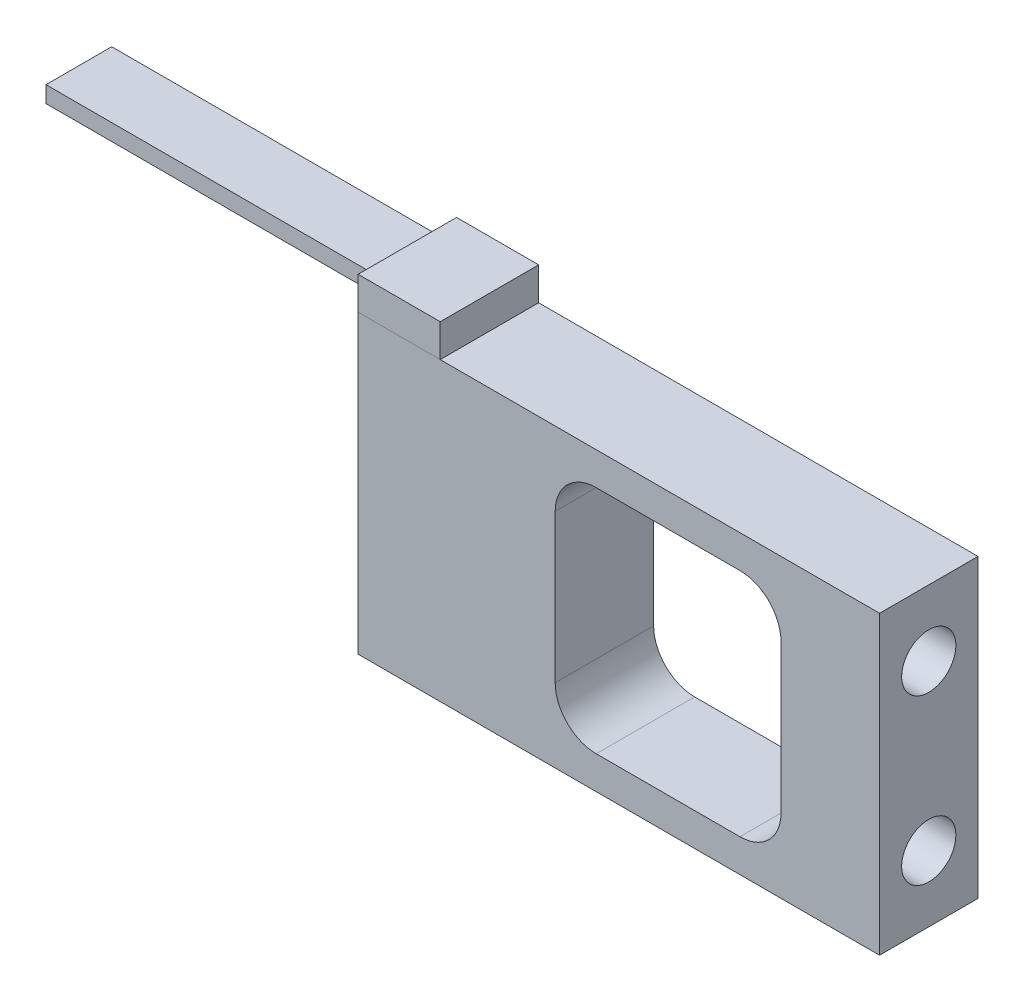
ISO-10303-21;
HEADER;
FILE_DESCRIPTION(('STEP AP214'),'2;1');
FILE_NAME('part.step','',(''),(''),'','','');
FILE_SCHEMA(('AUTOMOTIVE_DESIGN { 1 0 10303 214 1 1 1 1 }'));
ENDSEC;
DATA;
#1=APPLICATION_CONTEXT('core data for automotive mechanical design processes');
#2=APPLICATION_PROTOCOL_DEFINITION('international standard','automotive_design',2000,#1);
#3=PRODUCT_CONTEXT('',#1,'mechanical');
#4=PRODUCT('Part','Part','',(#3));
#5=PRODUCT_RELATED_PRODUCT_CATEGORY('part','',(#4));
#6=PRODUCT_DEFINITION_FORMATION('','',#4);
#7=PRODUCT_DEFINITION_CONTEXT('part definition',#1,'design');
#8=PRODUCT_DEFINITION('design','',#6,#7);
#9=PRODUCT_DEFINITION_SHAPE('','',#8);
#10=(LENGTH_UNIT() NAMED_UNIT(*) SI_UNIT(.MILLI.,.METRE.));
#11=(NAMED_UNIT(*) PLANE_ANGLE_UNIT() SI_UNIT($,.RADIAN.));
#12=(NAMED_UNIT(*) SI_UNIT($,.STERADIAN.) SOLID_ANGLE_UNIT());
#13=UNCERTAINTY_MEASURE_WITH_UNIT(LENGTH_MEASURE(1.E-05),#10,'distance_accuracy_value','');
#14=(GEOMETRIC_REPRESENTATION_CONTEXT(3) GLOBAL_UNCERTAINTY_ASSIGNED_CONTEXT((#13)) GLOBAL_UNIT_ASSIGNED_CONTEXT((#10,
#11,#12)) REPRESENTATION_CONTEXT('',''));
#15=CARTESIAN_POINT('',(0.,0.,0.));
#16=DIRECTION('',(0.,0.,1.));
#17=DIRECTION('',(1.,0.,0.));
#18=AXIS2_PLACEMENT_3D('',#15,#16,#17);
#19=CARTESIAN_POINT('',(-15.875,11.017,2.9972));
#20=DIRECTION('',(1.,0.,0.));
#21=DIRECTION('',(0.,1.,0.));
#22=AXIS2_PLACEMENT_3D('',#19,#20,#21);
#23=PLANE('',#22);
#24=DIRECTION('',(0.,0.,1.));
#25=VECTOR('',#24,1.);
#26=CARTESIAN_POINT('',(-15.875,9.01699999999999,2.9972));
#27=LINE('',#26,#25);
#28=CARTESIAN_POINT('',(-15.875,9.01699999999999,-2.9972));
#29=VERTEX_POINT('',#28);
#30=CARTESIAN_POINT('',(-15.875,9.01699999999999,2.9972));
#31=VERTEX_POINT('',#30);
#32=EDGE_CURVE('E132',#29,#31,#27,.T.);
#33=ORIENTED_EDGE('',*,*,#32,.T.);
#34=DIRECTION('',(0.,-1.,0.));
#35=VECTOR('',#34,1.);
#36=CARTESIAN_POINT('',(-15.875,11.017,2.9972));
#37=LINE('',#36,#35);
#38=CARTESIAN_POINT('',(-15.875,11.017,2.9972));
#39=VERTEX_POINT('',#38);
#40=EDGE_CURVE('E12',#39,#31,#37,.T.);
#41=ORIENTED_EDGE('',*,*,#40,.F.);
#42=DIRECTION('',(0.,0.,1.));
#43=VECTOR('',#42,1.);
#44=CARTESIAN_POINT('',(-15.875,11.017,2.9972));
#45=LINE('',#44,#43);
#46=CARTESIAN_POINT('',(-15.875,11.017,-2.9972));
#47=VERTEX_POINT('',#46);
#48=EDGE_CURVE('E141',#47,#39,#45,.T.);
#49=ORIENTED_EDGE('',*,*,#48,.F.);
#50=DIRECTION('',(0.,-1.,0.));
#51=VECTOR('',#50,1.);
#52=CARTESIAN_POINT('',(-15.875,11.017,-2.9972));
#53=LINE('',#52,#51);
#54=EDGE_CURVE('E150',#47,#29,#53,.T.);
#55=ORIENTED_EDGE('',*,*,#54,.T.);
#56=EDGE_LOOP('',(#33,#41,#49,#55));
#57=FACE_BOUND('',#56,.T.);
#58=DIRECTION('',(0.,-1.,0.));
#59=VECTOR('',#58,1.);
#60=CARTESIAN_POINT('',(-15.875,10.517,-2.));
#61=LINE('',#60,#59);
#62=CARTESIAN_POINT('',(-15.875,10.517,-2.));
#63=VERTEX_POINT('',#62);
#64=CARTESIAN_POINT('',(-15.875,9.51699999999999,-2.));
#65=VERTEX_POINT('',#64);
#66=EDGE_CURVE('E131',#63,#65,#61,.T.);
#67=ORIENTED_EDGE('',*,*,#66,.F.);
#68=DIRECTION('',(0.,0.,-1.));
#69=VECTOR('',#68,1.);
#70=CARTESIAN_POINT('',(-15.875,10.517,2.));
#71=LINE('',#70,#69);
#72=CARTESIAN_POINT('',(-15.875,10.517,2.));
#73=VERTEX_POINT('',#72);
#74=EDGE_CURVE('E128',#73,#63,#71,.T.);
#75=ORIENTED_EDGE('',*,*,#74,.F.);
#76=DIRECTION('',(0.,1.,0.));
#77=VECTOR('',#76,1.);
#78=CARTESIAN_POINT('',(-15.875,10.517,2.));
#79=LINE('',#78,#77);
#80=CARTESIAN_POINT('',(-15.875,9.51699999999999,2.));
#81=VERTEX_POINT('',#80);
#82=EDGE_CURVE('E66',#81,#73,#79,.T.);
#83=ORIENTED_EDGE('',*,*,#82,.F.);
#84=DIRECTION('',(0.,0.,1.));
#85=VECTOR('',#84,1.);
#86=CARTESIAN_POINT('',(-15.875,9.51699999999999,2.));
#87=LINE('',#86,#85);
#88=EDGE_CURVE('E61',#65,#81,#87,.T.);
#89=ORIENTED_EDGE('',*,*,#88,.F.);
#90=EDGE_LOOP('',(#67,#75,#83,#89));
#91=FACE_BOUND('',#90,.T.);
#92=ADVANCED_FACE('F47',(#57,#91),#23,.F.);
#93=CARTESIAN_POINT('',(-15.875,11.017,2.9972));
#94=DIRECTION('',(0.,0.,-1.));
#95=DIRECTION('',(-1.,0.,0.));
#96=AXIS2_PLACEMENT_3D('',#93,#94,#95);
#97=PLANE('',#96);
#98=DIRECTION('',(1.,0.,0.));
#99=VECTOR('',#98,1.);
#100=CARTESIAN_POINT('',(-15.875,9.01699999999999,2.9972));
#101=LINE('',#100,#99);
#102=CARTESIAN_POINT('',(-10.875,9.017,2.9972));
#103=VERTEX_POINT('',#102);
#104=EDGE_CURVE('E135',#31,#103,#101,.T.);
#105=ORIENTED_EDGE('',*,*,#104,.T.);
#106=DIRECTION('',(0.,-1.,0.));
#107=VECTOR('',#106,1.);
#108=CARTESIAN_POINT('',(-10.875,11.017,2.9972));
#109=LINE('',#108,#107);
#110=CARTESIAN_POINT('',(-10.875,11.017,2.9972));
#111=VERTEX_POINT('',#110);
#112=EDGE_CURVE('E54',#111,#103,#109,.T.);
#113=ORIENTED_EDGE('',*,*,#112,.F.);
#114=DIRECTION('',(1.,0.,0.));
#115=VECTOR('',#114,1.);
#116=CARTESIAN_POINT('',(-15.875,11.017,2.9972));
#117=LINE('',#116,#115);
#118=EDGE_CURVE('E144',#39,#111,#117,.T.);
#119=ORIENTED_EDGE('',*,*,#118,.F.);
#120=ORIENTED_EDGE('',*,*,#40,.T.);
#121=EDGE_LOOP('',(#105,#113,#119,#120));
#122=FACE_BOUND('',#121,.T.);
#123=ADVANCED_FACE('F181',(#122),#97,.F.);
#124=CARTESIAN_POINT('',(-10.875,11.017,2.9972));
#125=DIRECTION('',(-1.,0.,0.));
#126=DIRECTION('',(0.,-1.,0.));
#127=AXIS2_PLACEMENT_3D('',#124,#125,#126);
#128=PLANE('',#127);
#129=DIRECTION('',(0.,0.,-1.));
#130=VECTOR('',#129,1.);
#131=CARTESIAN_POINT('',(-10.875,9.017,2.9972));
#132=LINE('',#131,#130);
#133=CARTESIAN_POINT('',(-10.875,9.017,-2.9972));
#134=VERTEX_POINT('',#133);
#135=EDGE_CURVE('E153',#103,#134,#132,.T.);
#136=ORIENTED_EDGE('',*,*,#135,.T.);
#137=DIRECTION('',(0.,-1.,0.));
#138=VECTOR('',#137,1.);
#139=CARTESIAN_POINT('',(-10.875,11.017,-2.9972));
#140=LINE('',#139,#138);
#141=CARTESIAN_POINT('',(-10.875,11.017,-2.9972));
#142=VERTEX_POINT('',#141);
#143=EDGE_CURVE('E158',#142,#134,#140,.T.);
#144=ORIENTED_EDGE('',*,*,#143,.F.);
#145=DIRECTION('',(0.,0.,-1.));
#146=VECTOR('',#145,1.);
#147=CARTESIAN_POINT('',(-10.875,11.017,2.9972));
#148=LINE('',#147,#146);
#149=EDGE_CURVE('E147',#111,#142,#148,.T.);
#150=ORIENTED_EDGE('',*,*,#149,.F.);
#151=ORIENTED_EDGE('',*,*,#112,.T.);
#152=EDGE_LOOP('',(#136,#144,#150,#151));
#153=FACE_BOUND('',#152,.T.);
#154=ADVANCED_FACE('F165',(#153),#128,.F.);
#155=CARTESIAN_POINT('',(-15.875,11.017,-2.9972));
#156=DIRECTION('',(0.,0.,1.));
#157=DIRECTION('',(1.,0.,0.));
#158=AXIS2_PLACEMENT_3D('',#155,#156,#157);
#159=PLANE('',#158);
#160=DIRECTION('',(-1.,0.,0.));
#161=VECTOR('',#160,1.);
#162=CARTESIAN_POINT('',(-15.875,9.01699999999999,-2.9972));
#163=LINE('',#162,#161);
#164=EDGE_CURVE('E145',#134,#29,#163,.T.);
#165=ORIENTED_EDGE('',*,*,#164,.T.);
#166=ORIENTED_EDGE('',*,*,#54,.F.);
#167=DIRECTION('',(-1.,0.,0.));
#168=VECTOR('',#167,1.);
#169=CARTESIAN_POINT('',(-15.875,11.017,-2.9972));
#170=LINE('',#169,#168);
#171=EDGE_CURVE('E149',#142,#47,#170,.T.);
#172=ORIENTED_EDGE('',*,*,#171,.F.);
#173=ORIENTED_EDGE('',*,*,#143,.T.);
#174=EDGE_LOOP('',(#165,#166,#172,#173));
#175=FACE_BOUND('',#174,.T.);
#176=ADVANCED_FACE('F174',(#175),#159,.F.);
#177=CARTESIAN_POINT('',(0.,11.017,0.));
#178=DIRECTION('',(0.,-1.,0.));
#179=DIRECTION('',(1.,0.,0.));
#180=AXIS2_PLACEMENT_3D('',#177,#178,#179);
#181=PLANE('',#180);
#182=ORIENTED_EDGE('',*,*,#48,.T.);
#183=ORIENTED_EDGE('',*,*,#118,.T.);
#184=ORIENTED_EDGE('',*,*,#149,.T.);
#185=ORIENTED_EDGE('',*,*,#171,.T.);
#186=EDGE_LOOP('',(#182,#183,#184,#185));
#187=FACE_BOUND('',#186,.T.);
#188=ADVANCED_FACE('F180',(#187),#181,.F.);
#189=CARTESIAN_POINT('',(0.,9.017,0.));
#190=DIRECTION('',(0.,-1.,0.));
#191=DIRECTION('',(1.,0.,0.));
#192=AXIS2_PLACEMENT_3D('',#189,#190,#191);
#193=PLANE('',#192);
#194=ORIENTED_EDGE('',*,*,#32,.F.);
#195=ORIENTED_EDGE('',*,*,#164,.F.);
#196=ORIENTED_EDGE('',*,*,#135,.F.);
#197=ORIENTED_EDGE('',*,*,#104,.F.);
#198=EDGE_LOOP('',(#194,#195,#196,#197));
#199=FACE_BOUND('',#198,.T.);
#200=ADVANCED_FACE('F171',(#199),#193,.T.);
#201=CARTESIAN_POINT('',(-35.875,10.517,-2.));
#202=DIRECTION('',(0.,0.,1.));
#203=DIRECTION('',(0.,-1.,0.));
#204=AXIS2_PLACEMENT_3D('',#201,#202,#203);
#205=PLANE('',#204);
#206=ORIENTED_EDGE('',*,*,#66,.T.);
#207=DIRECTION('',(1.,0.,0.));
#208=VECTOR('',#207,1.);
#209=CARTESIAN_POINT('',(-35.875,9.51699999999999,-2.));
#210=LINE('',#209,#208);
#211=CARTESIAN_POINT('',(-35.875,9.51699999999999,-2.));
#212=VERTEX_POINT('',#211);
#213=EDGE_CURVE('E112',#212,#65,#210,.T.);
#214=ORIENTED_EDGE('',*,*,#213,.F.);
#215=DIRECTION('',(0.,-1.,0.));
#216=VECTOR('',#215,1.);
#217=CARTESIAN_POINT('',(-35.875,10.517,-2.));
#218=LINE('',#217,#216);
#219=CARTESIAN_POINT('',(-35.875,10.517,-2.));
#220=VERTEX_POINT('',#219);
#221=EDGE_CURVE('E119',#220,#212,#218,.T.);
#222=ORIENTED_EDGE('',*,*,#221,.F.);
#223=DIRECTION('',(1.,0.,0.));
#224=VECTOR('',#223,1.);
#225=CARTESIAN_POINT('',(-35.875,10.517,-2.));
#226=LINE('',#225,#224);
#227=EDGE_CURVE('E274',#220,#63,#226,.T.);
#228=ORIENTED_EDGE('',*,*,#227,.T.);
#229=EDGE_LOOP('',(#206,#214,#222,#228));
#230=FACE_BOUND('',#229,.T.);
#231=ADVANCED_FACE('F130',(#230),#205,.F.);
#232=CARTESIAN_POINT('',(-35.875,9.51699999999999,2.));
#233=DIRECTION('',(0.,1.,0.));
#234=DIRECTION('',(-1.,0.,0.));
#235=AXIS2_PLACEMENT_3D('',#232,#233,#234);
#236=PLANE('',#235);
#237=ORIENTED_EDGE('',*,*,#88,.T.);
#238=DIRECTION('',(1.,0.,0.));
#239=VECTOR('',#238,1.);
#240=CARTESIAN_POINT('',(-35.875,9.51699999999999,2.));
#241=LINE('',#240,#239);
#242=CARTESIAN_POINT('',(-35.875,9.51699999999999,2.));
#243=VERTEX_POINT('',#242);
#244=EDGE_CURVE('E115',#243,#81,#241,.T.);
#245=ORIENTED_EDGE('',*,*,#244,.F.);
#246=DIRECTION('',(0.,0.,1.));
#247=VECTOR('',#246,1.);
#248=CARTESIAN_POINT('',(-35.875,9.51699999999999,2.));
#249=LINE('',#248,#247);
#250=EDGE_CURVE('E108',#212,#243,#249,.T.);
#251=ORIENTED_EDGE('',*,*,#250,.F.);
#252=ORIENTED_EDGE('',*,*,#213,.T.);
#253=EDGE_LOOP('',(#237,#245,#251,#252));
#254=FACE_BOUND('',#253,.T.);
#255=ADVANCED_FACE('F110',(#254),#236,.F.);
#256=CARTESIAN_POINT('',(-35.875,10.517,2.));
#257=DIRECTION('',(0.,0.,-1.));
#258=DIRECTION('',(-1.,0.,0.));
#259=AXIS2_PLACEMENT_3D('',#256,#257,#258);
#260=PLANE('',#259);
#261=ORIENTED_EDGE('',*,*,#82,.T.);
#262=DIRECTION('',(1.,0.,0.));
#263=VECTOR('',#262,1.);
#264=CARTESIAN_POINT('',(-35.875,10.517,2.));
#265=LINE('',#264,#263);
#266=CARTESIAN_POINT('',(-35.875,10.517,2.));
#267=VERTEX_POINT('',#266);
#268=EDGE_CURVE('E137',#267,#73,#265,.T.);
#269=ORIENTED_EDGE('',*,*,#268,.F.);
#270=DIRECTION('',(0.,1.,0.));
#271=VECTOR('',#270,1.);
#272=CARTESIAN_POINT('',(-35.875,10.517,2.));
#273=LINE('',#272,#271);
#274=EDGE_CURVE('E118',#243,#267,#273,.T.);
#275=ORIENTED_EDGE('',*,*,#274,.F.);
#276=ORIENTED_EDGE('',*,*,#244,.T.);
#277=EDGE_LOOP('',(#261,#269,#275,#276));
#278=FACE_BOUND('',#277,.T.);
#279=ADVANCED_FACE('F199',(#278),#260,.F.);
#280=CARTESIAN_POINT('',(-35.875,10.517,2.));
#281=DIRECTION('',(0.,-1.,0.));
#282=DIRECTION('',(1.,0.,0.));
#283=AXIS2_PLACEMENT_3D('',#280,#281,#282);
#284=PLANE('',#283);
#285=ORIENTED_EDGE('',*,*,#74,.T.);
#286=ORIENTED_EDGE('',*,*,#227,.F.);
#287=DIRECTION('',(0.,0.,-1.));
#288=VECTOR('',#287,1.);
#289=CARTESIAN_POINT('',(-35.875,10.517,2.));
#290=LINE('',#289,#288);
#291=EDGE_CURVE('E124',#267,#220,#290,.T.);
#292=ORIENTED_EDGE('',*,*,#291,.F.);
#293=ORIENTED_EDGE('',*,*,#268,.T.);
#294=EDGE_LOOP('',(#285,#286,#292,#293));
#295=FACE_BOUND('',#294,.T.);
#296=ADVANCED_FACE('F202',(#295),#284,.F.);
#297=CARTESIAN_POINT('',(-35.875,0.,0.));
#298=DIRECTION('',(1.,0.,0.));
#299=DIRECTION('',(0.,0.,-1.));
#300=AXIS2_PLACEMENT_3D('',#297,#298,#299);
#301=PLANE('',#300);
#302=ORIENTED_EDGE('',*,*,#221,.T.);
#303=ORIENTED_EDGE('',*,*,#250,.T.);
#304=ORIENTED_EDGE('',*,*,#274,.T.);
#305=ORIENTED_EDGE('',*,*,#291,.T.);
#306=EDGE_LOOP('',(#302,#303,#304,#305));
#307=FACE_BOUND('',#306,.T.);
#308=ADVANCED_FACE('F122',(#307),#301,.F.);
#309=CLOSED_SHELL('',(#92,#123,#154,#176,#188,#200,#231,#255,#279,#296,#308));
#310=MANIFOLD_SOLID_BREP('B2',#309);
#311=CARTESIAN_POINT('',(-15.875,-9.017,2.9972));
#312=DIRECTION('',(1.,0.,0.));
#313=DIRECTION('',(0.,0.,-1.));
#314=AXIS2_PLACEMENT_3D('',#311,#312,#313);
#315=PLANE('',#314);
#316=CARTESIAN_POINT('',(-15.875,5.,0.));
#317=DIRECTION('',(-1.,0.,0.));
#318=DIRECTION('',(0.,0.,1.));
#319=AXIS2_PLACEMENT_3D('',#316,#317,#318);
#320=CIRCLE('',#319,1.65);
#321=CARTESIAN_POINT('',(-15.875,5.,1.65));
#322=VERTEX_POINT('',#321);
#323=EDGE_CURVE('E406',#322,#322,#320,.T.);
#324=ORIENTED_EDGE('',*,*,#323,.F.);
#325=EDGE_LOOP('',(#324));
#326=FACE_BOUND('',#325,.T.);
#327=CARTESIAN_POINT('',(-15.875,-5.,0.));
#328=DIRECTION('',(-1.,0.,0.));
#329=DIRECTION('',(0.,0.,1.));
#330=AXIS2_PLACEMENT_3D('',#327,#328,#329);
#331=CIRCLE('',#330,1.65);
#332=CARTESIAN_POINT('',(-15.875,-5.,1.65));
#333=VERTEX_POINT('',#332);
#334=EDGE_CURVE('E405',#333,#333,#331,.T.);
#335=ORIENTED_EDGE('',*,*,#334,.F.);
#336=EDGE_LOOP('',(#335));
#337=FACE_BOUND('',#336,.T.);
#338=DIRECTION('',(0.,-1.,0.));
#339=VECTOR('',#338,1.);
#340=CARTESIAN_POINT('',(-15.875,-9.017,-2.9972));
#341=LINE('',#340,#339);
#342=CARTESIAN_POINT('',(-15.875,9.017,-2.9972));
#343=VERTEX_POINT('',#342);
#344=CARTESIAN_POINT('',(-15.875,-9.017,-2.9972));
#345=VERTEX_POINT('',#344);
#346=EDGE_CURVE('E438',#343,#345,#341,.T.);
#347=ORIENTED_EDGE('',*,*,#346,.T.);
#348=DIRECTION('',(0.,0.,-1.));
#349=VECTOR('',#348,1.);
#350=CARTESIAN_POINT('',(-15.875,-9.017,2.9972));
#351=LINE('',#350,#349);
#352=CARTESIAN_POINT('',(-15.875,-9.017,2.9972));
#353=VERTEX_POINT('',#352);
#354=EDGE_CURVE('E475',#353,#345,#351,.T.);
#355=ORIENTED_EDGE('',*,*,#354,.F.);
#356=DIRECTION('',(0.,-1.,0.));
#357=VECTOR('',#356,1.);
#358=CARTESIAN_POINT('',(-15.875,-9.017,2.9972));
#359=LINE('',#358,#357);
#360=CARTESIAN_POINT('',(-15.875,9.017,2.9972));
#361=VERTEX_POINT('',#360);
#362=EDGE_CURVE('E449',#361,#353,#359,.T.);
#363=ORIENTED_EDGE('',*,*,#362,.F.);
#364=DIRECTION('',(0.,0.,-1.));
#365=VECTOR('',#364,1.);
#366=CARTESIAN_POINT('',(-15.875,9.017,2.9972));
#367=LINE('',#366,#365);
#368=EDGE_CURVE('E459',#361,#343,#367,.T.);
#369=ORIENTED_EDGE('',*,*,#368,.T.);
#370=EDGE_LOOP('',(#347,#355,#363,#369));
#371=FACE_BOUND('',#370,.T.);
#372=ADVANCED_FACE('F286',(#326,#337,#371),#315,.F.);
#373=CARTESIAN_POINT('',(15.875,-9.017,2.9972));
#374=DIRECTION('',(0.,1.,0.));
#375=DIRECTION('',(-1.,0.,0.));
#376=AXIS2_PLACEMENT_3D('',#373,#374,#375);
#377=PLANE('',#376);
#378=DIRECTION('',(1.,0.,0.));
#379=VECTOR('',#378,1.);
#380=CARTESIAN_POINT('',(15.875,-9.017,-2.9972));
#381=LINE('',#380,#379);
#382=CARTESIAN_POINT('',(15.875,-9.017,-2.9972));
#383=VERTEX_POINT('',#382);
#384=EDGE_CURVE('E462',#345,#383,#381,.T.);
#385=ORIENTED_EDGE('',*,*,#384,.T.);
#386=DIRECTION('',(0.,0.,-1.));
#387=VECTOR('',#386,1.);
#388=CARTESIAN_POINT('',(15.875,-9.017,2.9972));
#389=LINE('',#388,#387);
#390=CARTESIAN_POINT('',(15.875,-9.017,2.9972));
#391=VERTEX_POINT('',#390);
#392=EDGE_CURVE('E472',#391,#383,#389,.T.);
#393=ORIENTED_EDGE('',*,*,#392,.F.);
#394=DIRECTION('',(1.,0.,0.));
#395=VECTOR('',#394,1.);
#396=CARTESIAN_POINT('',(15.875,-9.017,2.9972));
#397=LINE('',#396,#395);
#398=EDGE_CURVE('E452',#353,#391,#397,.T.);
#399=ORIENTED_EDGE('',*,*,#398,.F.);
#400=ORIENTED_EDGE('',*,*,#354,.T.);
#401=EDGE_LOOP('',(#385,#393,#399,#400));
#402=FACE_BOUND('',#401,.T.);
#403=ADVANCED_FACE('F563',(#402),#377,.F.);
#404=CARTESIAN_POINT('',(15.875,-9.017,2.9972));
#405=DIRECTION('',(-1.,0.,0.));
#406=DIRECTION('',(0.,0.,1.));
#407=AXIS2_PLACEMENT_3D('',#404,#405,#406);
#408=PLANE('',#407);
#409=CARTESIAN_POINT('',(15.875,5.,0.));
#410=DIRECTION('',(1.,0.,0.));
#411=DIRECTION('',(0.,0.,-1.));
#412=AXIS2_PLACEMENT_3D('',#409,#410,#411);
#413=CIRCLE('',#412,1.65);
#414=CARTESIAN_POINT('',(15.875,5.,-1.65));
#415=VERTEX_POINT('',#414);
#416=EDGE_CURVE('E416',#415,#415,#413,.T.);
#417=ORIENTED_EDGE('',*,*,#416,.F.);
#418=EDGE_LOOP('',(#417));
#419=FACE_BOUND('',#418,.T.);
#420=CARTESIAN_POINT('',(15.875,-5.,0.));
#421=DIRECTION('',(1.,0.,0.));
#422=DIRECTION('',(0.,0.,-1.));
#423=AXIS2_PLACEMENT_3D('',#420,#421,#422);
#424=CIRCLE('',#423,1.65);
#425=CARTESIAN_POINT('',(15.875,-5.,-1.65));
#426=VERTEX_POINT('',#425);
#427=EDGE_CURVE('E420',#426,#426,#424,.T.);
#428=ORIENTED_EDGE('',*,*,#427,.F.);
#429=EDGE_LOOP('',(#428));
#430=FACE_BOUND('',#429,.T.);
#431=DIRECTION('',(0.,1.,0.));
#432=VECTOR('',#431,1.);
#433=CARTESIAN_POINT('',(15.875,-9.017,-2.9972));
#434=LINE('',#433,#432);
#435=CARTESIAN_POINT('',(15.875,9.017,-2.9972));
#436=VERTEX_POINT('',#435);
#437=EDGE_CURVE('E464',#383,#436,#434,.T.);
#438=ORIENTED_EDGE('',*,*,#437,.T.);
#439=DIRECTION('',(0.,0.,-1.));
#440=VECTOR('',#439,1.);
#441=CARTESIAN_POINT('',(15.875,9.017,2.9972));
#442=LINE('',#441,#440);
#443=CARTESIAN_POINT('',(15.875,9.017,2.9972));
#444=VERTEX_POINT('',#443);
#445=EDGE_CURVE('E469',#444,#436,#442,.T.);
#446=ORIENTED_EDGE('',*,*,#445,.F.);
#447=DIRECTION('',(0.,1.,0.));
#448=VECTOR('',#447,1.);
#449=CARTESIAN_POINT('',(15.875,-9.017,2.9972));
#450=LINE('',#449,#448);
#451=EDGE_CURVE('E455',#391,#444,#450,.T.);
#452=ORIENTED_EDGE('',*,*,#451,.F.);
#453=ORIENTED_EDGE('',*,*,#392,.T.);
#454=EDGE_LOOP('',(#438,#446,#452,#453));
#455=FACE_BOUND('',#454,.T.);
#456=ADVANCED_FACE('F559',(#419,#430,#455),#408,.F.);
#457=CARTESIAN_POINT('',(15.875,9.017,2.9972));
#458=DIRECTION('',(0.,-1.,0.));
#459=DIRECTION('',(1.,0.,0.));
#460=AXIS2_PLACEMENT_3D('',#457,#458,#459);
#461=PLANE('',#460);
#462=DIRECTION('',(-1.,0.,0.));
#463=VECTOR('',#462,1.);
#464=CARTESIAN_POINT('',(15.875,9.017,-2.9972));
#465=LINE('',#464,#463);
#466=EDGE_CURVE('E453',#436,#343,#465,.T.);
#467=ORIENTED_EDGE('',*,*,#466,.T.);
#468=ORIENTED_EDGE('',*,*,#368,.F.);
#469=DIRECTION('',(-1.,0.,0.));
#470=VECTOR('',#469,1.);
#471=CARTESIAN_POINT('',(15.875,9.017,2.9972));
#472=LINE('',#471,#470);
#473=EDGE_CURVE('E457',#444,#361,#472,.T.);
#474=ORIENTED_EDGE('',*,*,#473,.F.);
#475=ORIENTED_EDGE('',*,*,#445,.T.);
#476=EDGE_LOOP('',(#467,#468,#474,#475));
#477=FACE_BOUND('',#476,.T.);
#478=ADVANCED_FACE('F552',(#477),#461,.F.);
#479=CARTESIAN_POINT('',(0.,0.,2.9972));
#480=DIRECTION('',(0.,0.,1.));
#481=DIRECTION('',(1.,0.,0.));
#482=AXIS2_PLACEMENT_3D('',#479,#480,#481);
#483=PLANE('',#482);
#484=DIRECTION('',(0.,-1.,0.));
#485=VECTOR('',#484,1.);
#486=CARTESIAN_POINT('',(-3.875,-7.017,2.9972));
#487=LINE('',#486,#485);
#488=CARTESIAN_POINT('',(-3.875,4.517,2.9972));
#489=VERTEX_POINT('',#488);
#490=CARTESIAN_POINT('',(-3.875,-4.517,2.9972));
#491=VERTEX_POINT('',#490);
#492=EDGE_CURVE('E424',#489,#491,#487,.T.);
#493=ORIENTED_EDGE('',*,*,#492,.F.);
#494=CARTESIAN_POINT('',(-1.375,4.517,2.9972));
#495=DIRECTION('',(0.,0.,1.));
#496=DIRECTION('',(1.,0.,0.));
#497=AXIS2_PLACEMENT_3D('',#494,#495,#496);
#498=CIRCLE('',#497,2.5);
#499=CARTESIAN_POINT('',(-1.375,7.017,2.9972));
#500=VERTEX_POINT('',#499);
#501=EDGE_CURVE('E513',#489,#500,#498,.F.);
#502=ORIENTED_EDGE('',*,*,#501,.T.);
#503=DIRECTION('',(-1.,0.,0.));
#504=VECTOR('',#503,1.);
#505=CARTESIAN_POINT('',(9.875,7.017,2.9972));
#506=LINE('',#505,#504);
#507=CARTESIAN_POINT('',(7.375,7.017,2.9972));
#508=VERTEX_POINT('',#507);
#509=EDGE_CURVE('E429',#508,#500,#506,.T.);
#510=ORIENTED_EDGE('',*,*,#509,.F.);
#511=CARTESIAN_POINT('',(7.375,4.517,2.9972));
#512=DIRECTION('',(0.,0.,1.));
#513=DIRECTION('',(1.,0.,0.));
#514=AXIS2_PLACEMENT_3D('',#511,#512,#513);
#515=CIRCLE('',#514,2.5);
#516=CARTESIAN_POINT('',(9.875,4.517,2.9972));
#517=VERTEX_POINT('',#516);
#518=EDGE_CURVE('E501',#508,#517,#515,.F.);
#519=ORIENTED_EDGE('',*,*,#518,.T.);
#520=DIRECTION('',(0.,1.,0.));
#521=VECTOR('',#520,1.);
#522=CARTESIAN_POINT('',(9.875,-7.017,2.9972));
#523=LINE('',#522,#521);
#524=CARTESIAN_POINT('',(9.875,-4.517,2.9972));
#525=VERTEX_POINT('',#524);
#526=EDGE_CURVE('E444',#525,#517,#523,.T.);
#527=ORIENTED_EDGE('',*,*,#526,.F.);
#528=CARTESIAN_POINT('',(7.375,-4.517,2.9972));
#529=DIRECTION('',(0.,0.,1.));
#530=DIRECTION('',(1.,0.,0.));
#531=AXIS2_PLACEMENT_3D('',#528,#529,#530);
#532=CIRCLE('',#531,2.5);
#533=CARTESIAN_POINT('',(7.375,-7.017,2.9972));
#534=VERTEX_POINT('',#533);
#535=EDGE_CURVE('E505',#525,#534,#532,.F.);
#536=ORIENTED_EDGE('',*,*,#535,.T.);
#537=DIRECTION('',(1.,0.,0.));
#538=VECTOR('',#537,1.);
#539=CARTESIAN_POINT('',(9.875,-7.017,2.9972));
#540=LINE('',#539,#538);
#541=CARTESIAN_POINT('',(-1.375,-7.017,2.9972));
#542=VERTEX_POINT('',#541);
#543=EDGE_CURVE('E441',#542,#534,#540,.T.);
#544=ORIENTED_EDGE('',*,*,#543,.F.);
#545=CARTESIAN_POINT('',(-1.375,-4.517,2.9972));
#546=DIRECTION('',(0.,0.,1.));
#547=DIRECTION('',(1.,0.,0.));
#548=AXIS2_PLACEMENT_3D('',#545,#546,#547);
#549=CIRCLE('',#548,2.5);
#550=EDGE_CURVE('E509',#542,#491,#549,.F.);
#551=ORIENTED_EDGE('',*,*,#550,.T.);
#552=EDGE_LOOP('',(#493,#502,#510,#519,#527,#536,#544,#551));
#553=FACE_BOUND('',#552,.T.);
#554=ORIENTED_EDGE('',*,*,#362,.T.);
#555=ORIENTED_EDGE('',*,*,#398,.T.);
#556=ORIENTED_EDGE('',*,*,#451,.T.);
#557=ORIENTED_EDGE('',*,*,#473,.T.);
#558=EDGE_LOOP('',(#554,#555,#556,#557));
#559=FACE_BOUND('',#558,.T.);
#560=ADVANCED_FACE('F549',(#553,#559),#483,.T.);
#561=CARTESIAN_POINT('',(0.,0.,-2.9972));
#562=DIRECTION('',(0.,0.,1.));
#563=DIRECTION('',(1.,0.,0.));
#564=AXIS2_PLACEMENT_3D('',#561,#562,#563);
#565=PLANE('',#564);
#566=DIRECTION('',(0.,1.,0.));
#567=VECTOR('',#566,1.);
#568=CARTESIAN_POINT('',(9.875,-7.017,-2.9972));
#569=LINE('',#568,#567);
#570=CARTESIAN_POINT('',(9.875,-4.517,-2.9972));
#571=VERTEX_POINT('',#570);
#572=CARTESIAN_POINT('',(9.875,4.517,-2.9972));
#573=VERTEX_POINT('',#572);
#574=EDGE_CURVE('E432',#571,#573,#569,.T.);
#575=ORIENTED_EDGE('',*,*,#574,.T.);
#576=CARTESIAN_POINT('',(7.375,4.517,-2.9972));
#577=DIRECTION('',(0.,0.,1.));
#578=DIRECTION('',(1.,0.,0.));
#579=AXIS2_PLACEMENT_3D('',#576,#577,#578);
#580=CIRCLE('',#579,2.5);
#581=CARTESIAN_POINT('',(7.375,7.017,-2.9972));
#582=VERTEX_POINT('',#581);
#583=EDGE_CURVE('E503',#573,#582,#580,.T.);
#584=ORIENTED_EDGE('',*,*,#583,.T.);
#585=DIRECTION('',(-1.,0.,0.));
#586=VECTOR('',#585,1.);
#587=CARTESIAN_POINT('',(9.875,7.017,-2.9972));
#588=LINE('',#587,#586);
#589=CARTESIAN_POINT('',(-1.375,7.017,-2.9972));
#590=VERTEX_POINT('',#589);
#591=EDGE_CURVE('E435',#582,#590,#588,.T.);
#592=ORIENTED_EDGE('',*,*,#591,.T.);
#593=CARTESIAN_POINT('',(-1.375,4.517,-2.9972));
#594=DIRECTION('',(0.,0.,1.));
#595=DIRECTION('',(1.,0.,0.));
#596=AXIS2_PLACEMENT_3D('',#593,#594,#595);
#597=CIRCLE('',#596,2.5);
#598=CARTESIAN_POINT('',(-3.875,4.517,-2.9972));
#599=VERTEX_POINT('',#598);
#600=EDGE_CURVE('E515',#590,#599,#597,.T.);
#601=ORIENTED_EDGE('',*,*,#600,.T.);
#602=DIRECTION('',(0.,-1.,0.));
#603=VECTOR('',#602,1.);
#604=CARTESIAN_POINT('',(-3.875,-7.017,-2.9972));
#605=LINE('',#604,#603);
#606=CARTESIAN_POINT('',(-3.875,-4.517,-2.9972));
#607=VERTEX_POINT('',#606);
#608=EDGE_CURVE('E425',#599,#607,#605,.T.);
#609=ORIENTED_EDGE('',*,*,#608,.T.);
#610=CARTESIAN_POINT('',(-1.375,-4.517,-2.9972));
#611=DIRECTION('',(0.,0.,1.));
#612=DIRECTION('',(1.,0.,0.));
#613=AXIS2_PLACEMENT_3D('',#610,#611,#612);
#614=CIRCLE('',#613,2.5);
#615=CARTESIAN_POINT('',(-1.375,-7.017,-2.9972));
#616=VERTEX_POINT('',#615);
#617=EDGE_CURVE('E511',#607,#616,#614,.T.);
#618=ORIENTED_EDGE('',*,*,#617,.T.);
#619=DIRECTION('',(1.,0.,0.));
#620=VECTOR('',#619,1.);
#621=CARTESIAN_POINT('',(9.875,-7.017,-2.9972));
#622=LINE('',#621,#620);
#623=CARTESIAN_POINT('',(7.375,-7.017,-2.9972));
#624=VERTEX_POINT('',#623);
#625=EDGE_CURVE('E428',#616,#624,#622,.T.);
#626=ORIENTED_EDGE('',*,*,#625,.T.);
#627=CARTESIAN_POINT('',(7.375,-4.517,-2.9972));
#628=DIRECTION('',(0.,0.,1.));
#629=DIRECTION('',(1.,0.,0.));
#630=AXIS2_PLACEMENT_3D('',#627,#628,#629);
#631=CIRCLE('',#630,2.5);
#632=EDGE_CURVE('E507',#624,#571,#631,.T.);
#633=ORIENTED_EDGE('',*,*,#632,.T.);
#634=EDGE_LOOP('',(#575,#584,#592,#601,#609,#618,#626,#633));
#635=FACE_BOUND('',#634,.T.);
#636=ORIENTED_EDGE('',*,*,#346,.F.);
#637=ORIENTED_EDGE('',*,*,#466,.F.);
#638=ORIENTED_EDGE('',*,*,#437,.F.);
#639=ORIENTED_EDGE('',*,*,#384,.F.);
#640=EDGE_LOOP('',(#636,#637,#638,#639));
#641=FACE_BOUND('',#640,.T.);
#642=ADVANCED_FACE('F547',(#635,#641),#565,.F.);
#643=CARTESIAN_POINT('',(-3.875,-7.017,-2.9972));
#644=DIRECTION('',(-1.,0.,0.));
#645=DIRECTION('',(0.,0.,1.));
#646=AXIS2_PLACEMENT_3D('',#643,#644,#645);
#647=PLANE('',#646);
#648=ORIENTED_EDGE('',*,*,#492,.T.);
#649=DIRECTION('',(0.,0.,1.));
#650=VECTOR('',#649,1.);
#651=CARTESIAN_POINT('',(-3.875,-4.517,-2.9972));
#652=LINE('',#651,#650);
#653=EDGE_CURVE('E499',#491,#607,#652,.F.);
#654=ORIENTED_EDGE('',*,*,#653,.T.);
#655=ORIENTED_EDGE('',*,*,#608,.F.);
#656=DIRECTION('',(0.,0.,1.));
#657=VECTOR('',#656,1.);
#658=CARTESIAN_POINT('',(-3.875,4.517,2.9972));
#659=LINE('',#658,#657);
#660=EDGE_CURVE('E496',#599,#489,#659,.T.);
#661=ORIENTED_EDGE('',*,*,#660,.T.);
#662=EDGE_LOOP('',(#648,#654,#655,#661));
#663=FACE_BOUND('',#662,.T.);
#664=ADVANCED_FACE('F535',(#663),#647,.F.);
#665=CARTESIAN_POINT('',(9.875,7.017,-2.9972));
#666=DIRECTION('',(0.,1.,0.));
#667=DIRECTION('',(0.,0.,1.));
#668=AXIS2_PLACEMENT_3D('',#665,#666,#667);
#669=PLANE('',#668);
#670=ORIENTED_EDGE('',*,*,#591,.F.);
#671=DIRECTION('',(0.,0.,1.));
#672=VECTOR('',#671,1.);
#673=CARTESIAN_POINT('',(7.375,7.017,2.9972));
#674=LINE('',#673,#672);
#675=EDGE_CURVE('E480',#582,#508,#674,.T.);
#676=ORIENTED_EDGE('',*,*,#675,.T.);
#677=ORIENTED_EDGE('',*,*,#509,.T.);
#678=DIRECTION('',(0.,0.,1.));
#679=VECTOR('',#678,1.);
#680=CARTESIAN_POINT('',(-1.375,7.017,-2.9972));
#681=LINE('',#680,#679);
#682=EDGE_CURVE('E478',#500,#590,#681,.F.);
#683=ORIENTED_EDGE('',*,*,#682,.T.);
#684=EDGE_LOOP('',(#670,#676,#677,#683));
#685=FACE_BOUND('',#684,.T.);
#686=ADVANCED_FACE('F531',(#685),#669,.F.);
#687=CARTESIAN_POINT('',(9.875,-7.017,-2.9972));
#688=DIRECTION('',(1.,0.,0.));
#689=DIRECTION('',(0.,0.,-1.));
#690=AXIS2_PLACEMENT_3D('',#687,#688,#689);
#691=PLANE('',#690);
#692=DIRECTION('',(0.,0.,1.));
#693=VECTOR('',#692,1.);
#694=CARTESIAN_POINT('',(9.875,4.517,-2.9972));
#695=LINE('',#694,#693);
#696=CARTESIAN_POINT('',(9.875,4.517,1.57772335978143));
#697=VERTEX_POINT('',#696);
#698=EDGE_CURVE('E488',#517,#697,#695,.F.);
#699=ORIENTED_EDGE('',*,*,#698,.T.);
#700=CARTESIAN_POINT('',(9.875,5.,0.));
#701=DIRECTION('',(1.,0.,0.));
#702=DIRECTION('',(0.,0.,-1.));
#703=AXIS2_PLACEMENT_3D('',#700,#701,#702);
#704=CIRCLE('',#703,1.65);
#705=CARTESIAN_POINT('',(9.875,4.517,-1.57772335978143));
#706=VERTEX_POINT('',#705);
#707=EDGE_CURVE('E305',#697,#706,#704,.T.);
#708=ORIENTED_EDGE('',*,*,#707,.T.);
#709=EDGE_CURVE('E487',#706,#573,#695,.F.);
#710=ORIENTED_EDGE('',*,*,#709,.T.);
#711=ORIENTED_EDGE('',*,*,#574,.F.);
#712=DIRECTION('',(0.,0.,1.));
#713=VECTOR('',#712,1.);
#714=CARTESIAN_POINT('',(9.875,-4.517,2.9972));
#715=LINE('',#714,#713);
#716=CARTESIAN_POINT('',(9.875,-4.517,-1.57772335978143));
#717=VERTEX_POINT('',#716);
#718=EDGE_CURVE('E484',#571,#717,#715,.T.);
#719=ORIENTED_EDGE('',*,*,#718,.T.);
#720=CARTESIAN_POINT('',(9.875,-5.,0.));
#721=DIRECTION('',(1.,0.,0.));
#722=DIRECTION('',(0.,0.,-1.));
#723=AXIS2_PLACEMENT_3D('',#720,#721,#722);
#724=CIRCLE('',#723,1.65);
#725=CARTESIAN_POINT('',(9.875,-4.517,1.57772335978143));
#726=VERTEX_POINT('',#725);
#727=EDGE_CURVE('E311',#717,#726,#724,.T.);
#728=ORIENTED_EDGE('',*,*,#727,.T.);
#729=EDGE_CURVE('E483',#726,#525,#715,.T.);
#730=ORIENTED_EDGE('',*,*,#729,.T.);
#731=ORIENTED_EDGE('',*,*,#526,.T.);
#732=EDGE_LOOP('',(#699,#708,#710,#711,#719,#728,#730,#731));
#733=FACE_BOUND('',#732,.T.);
#734=ADVANCED_FACE('F534',(#733),#691,.F.);
#735=CARTESIAN_POINT('',(9.875,-7.017,-2.9972));
#736=DIRECTION('',(0.,-1.,0.));
#737=DIRECTION('',(0.,0.,-1.));
#738=AXIS2_PLACEMENT_3D('',#735,#736,#737);
#739=PLANE('',#738);
#740=ORIENTED_EDGE('',*,*,#543,.T.);
#741=DIRECTION('',(0.,0.,1.));
#742=VECTOR('',#741,1.);
#743=CARTESIAN_POINT('',(7.375,-7.017,-2.9972));
#744=LINE('',#743,#742);
#745=EDGE_CURVE('E494',#534,#624,#744,.F.);
#746=ORIENTED_EDGE('',*,*,#745,.T.);
#747=ORIENTED_EDGE('',*,*,#625,.F.);
#748=DIRECTION('',(0.,0.,1.));
#749=VECTOR('',#748,1.);
#750=CARTESIAN_POINT('',(-1.375,-7.017,2.9972));
#751=LINE('',#750,#749);
#752=EDGE_CURVE('E491',#616,#542,#751,.T.);
#753=ORIENTED_EDGE('',*,*,#752,.T.);
#754=EDGE_LOOP('',(#740,#746,#747,#753));
#755=FACE_BOUND('',#754,.T.);
#756=ADVANCED_FACE('F539',(#755),#739,.F.);
#757=CARTESIAN_POINT('',(7.375,4.517,-2.9972));
#758=DIRECTION('',(0.,0.,-1.));
#759=DIRECTION('',(-1.,0.,0.));
#760=AXIS2_PLACEMENT_3D('',#757,#758,#759);
#761=CYLINDRICAL_SURFACE('',#760,2.5);
#762=ORIENTED_EDGE('',*,*,#709,.F.);
#763=CARTESIAN_POINT('',(9.875,4.517,-1.57772335978143));
#764=CARTESIAN_POINT('',(9.8750074165336,4.55552520405937,-1.5895249817341));
#765=CARTESIAN_POINT('',(9.87410963393027,4.59448773739675,-1.59990192603449));
#766=CARTESIAN_POINT('',(9.87043681224254,4.67297703519233,-1.61776681736128));
#767=CARTESIAN_POINT('',(9.86766200984166,4.71250372789757,-1.62525512844408));
#768=CARTESIAN_POINT('',(9.86018552861976,4.79163870365349,-1.63727844206418));
#769=CARTESIAN_POINT('',(9.85549275501525,4.83124577890713,-1.64182684606018));
#770=CARTESIAN_POINT('',(9.8441779642921,4.91039803701343,-1.64804428850134));
#771=CARTESIAN_POINT('',(9.8375560097087,4.94994322183051,-1.64971342026719));
#772=CARTESIAN_POINT('',(9.81482598513335,5.06804272097066,-1.65046927027544));
#773=CARTESIAN_POINT('',(9.79584761561536,5.14612653980343,-1.64531413872191));
#774=CARTESIAN_POINT('',(9.75095578896096,5.29878704020835,-1.62455618489392));
#775=CARTESIAN_POINT('',(9.7250377828673,5.37336138347034,-1.60894649950811));
#776=CARTESIAN_POINT('',(9.66616266257818,5.520549527306,-1.56767637336217));
#777=CARTESIAN_POINT('',(9.63295789499544,5.59295324995171,-1.54162540964007));
#778=CARTESIAN_POINT('',(9.5616018521885,5.73143725798299,-1.48095458112662));
#779=CARTESIAN_POINT('',(9.52344690818341,5.79751278951362,-1.44632834337083));
#780=CARTESIAN_POINT('',(9.42531851980412,5.95154000859481,-1.35223294090928));
#781=CARTESIAN_POINT('',(9.36333752576311,6.03570439444945,-1.28863954861637));
#782=CARTESIAN_POINT('',(9.23591152247134,6.18942107981341,-1.14832922632409));
#783=CARTESIAN_POINT('',(9.17045901207632,6.25893997771589,-1.07158300610725));
#784=CARTESIAN_POINT('',(9.05209977363799,6.37249878602359,-0.91985827542104));
#785=CARTESIAN_POINT('',(8.99894944922913,6.41886056937868,-0.846791223708805));
#786=CARTESIAN_POINT('',(8.89790918252603,6.50066141511303,-0.691516753673933));
#787=CARTESIAN_POINT('',(8.85000307913795,6.53613467934598,-0.609339083152118));
#788=CARTESIAN_POINT('',(8.78477243271673,6.58179934080557,-0.472368570562273));
#789=CARTESIAN_POINT('',(8.76317568195551,6.59629303818367,-0.421076147916328));
#790=CARTESIAN_POINT('',(8.72618932210233,6.6205145574916,-0.315231475342477));
#791=CARTESIAN_POINT('',(8.71078835758313,6.63025110525693,-0.260685401319681));
#792=CARTESIAN_POINT('',(8.68831007743379,6.64430049181027,-0.148352533246544));
#793=CARTESIAN_POINT('',(8.68134635500934,6.64853936599797,-0.0905322526036219));
#794=CARTESIAN_POINT('',(8.67761943615212,6.65082081757301,0.0255523498849782));
#795=CARTESIAN_POINT('',(8.68084977238706,6.64886732352975,0.0838163668151377));
#796=CARTESIAN_POINT('',(8.69558000678736,6.63976224602553,0.190010626763634));
#797=CARTESIAN_POINT('',(8.70579873865594,6.63341432517623,0.238204038325944));
#798=CARTESIAN_POINT('',(8.73173999101664,6.61687973287119,0.332399624849637));
#799=CARTESIAN_POINT('',(8.74746884426714,6.60668864344357,0.378399209046919));
#800=CARTESIAN_POINT('',(8.79656221584043,6.57383251762467,0.50226132937352));
#801=CARTESIAN_POINT('',(8.83419303257113,6.54759874968929,0.577459165178868));
#802=CARTESIAN_POINT('',(8.91582398897714,6.48638850586397,0.720586108483907));
#803=CARTESIAN_POINT('',(8.95984897104202,6.45137752501593,0.788484980453512));
#804=CARTESIAN_POINT('',(9.03805153805053,6.38412293008744,0.899821226724096));
#805=CARTESIAN_POINT('',(9.07160923450544,6.35376431218356,0.94485197552906));
#806=CARTESIAN_POINT('',(9.13918488674848,6.28896178684561,1.03150800435772));
#807=CARTESIAN_POINT('',(9.17320303784852,6.25451609440779,1.07313178289862));
#808=CARTESIAN_POINT('',(9.27470758076697,6.14517610778477,1.19278745450183));
#809=CARTESIAN_POINT('',(9.34178499993555,6.06416304815796,1.265794727942));
#810=CARTESIAN_POINT('',(9.45645079333574,5.90450496922904,1.38276450507315));
#811=CARTESIAN_POINT('',(9.50521077208619,5.8287971900785,1.42961251001121));
#812=CARTESIAN_POINT('',(9.59631582735291,5.66776578609057,1.51152661790729));
#813=CARTESIAN_POINT('',(9.63867204499201,5.58245932271497,1.54661331549464));
#814=CARTESIAN_POINT('',(9.70811643318109,5.4187209387987,1.5978875456512));
#815=CARTESIAN_POINT('',(9.73657490608303,5.34155769877668,1.61626501072504));
#816=CARTESIAN_POINT('',(9.7860611637491,5.1830613064034,1.64176736446758));
#817=CARTESIAN_POINT('',(9.80709666159065,5.10173258358662,1.64890396019225));
#818=CARTESIAN_POINT('',(9.8325413223025,4.97778703344877,1.65038229734671));
#819=CARTESIAN_POINT('',(9.84003984982,4.93579908742215,1.64928996892634));
#820=CARTESIAN_POINT('',(9.85286009975142,4.85168620651806,1.64386011868463));
#821=CARTESIAN_POINT('',(9.85818173298592,4.80956126609967,1.63952246393469));
#822=CARTESIAN_POINT('',(9.86666826559597,4.72530551936945,1.62753296045965));
#823=CARTESIAN_POINT('',(9.86981984797799,4.6831762362717,1.61986111102108));
#824=CARTESIAN_POINT('',(9.87399072284254,4.5995324053103,1.60124011531291));
#825=CARTESIAN_POINT('',(9.87500961541181,4.55801797419006,1.59029035482281));
#826=CARTESIAN_POINT('',(9.875,4.517,1.57772335978143));
#827=B_SPLINE_CURVE_WITH_KNOTS('',3,(#763,#764,#765,#766,#767,#768,#769,#770,#771,#772,#773,
#774,#775,#776,#777,#778,#779,#780,#781,#782,#783,#784,#785,#786,#787,#788,#789,#790,#791,#792,
#793,#794,#795,#796,#797,#798,#799,#800,#801,#802,#803,#804,#805,#806,#807,#808,#809,#810,#811,
#812,#813,#814,#815,#816,#817,#818,#819,#820,#821,#822,#823,#824,#825,#826),.UNSPECIFIED.,.F.,
.F.,(4,2,2,2,2,2,2,2,2,2,2,2,2,2,2,2,2,2,2,2,2,2,2,2,2,2,2,2,2,2,2,4),(0.,0.120840364311315,
0.241665494050533,0.361935888291779,0.48220238435099,0.722538341263649,0.963032226609173,
1.21351486019383,1.46418420882112,1.8293110881734,2.19526189791745,2.49909134698761,
2.80195643570617,2.97402311943849,3.14577299255024,3.31981037194445,3.49373736044632,
3.64217753072725,3.7907888653897,4.05354821750896,4.31735718643259,4.50864562796707,
4.70001792317051,5.08197911208024,5.38541430158037,5.68831535116086,5.9401084169945,
6.19163907347793,6.31948744184372,6.44734104716655,6.57597242428147,6.70462791966415),.UNSPECIFIED.);
#828=EDGE_CURVE('E45',#706,#697,#827,.T.);
#829=ORIENTED_EDGE('',*,*,#828,.T.);
#830=ORIENTED_EDGE('',*,*,#698,.F.);
#831=ORIENTED_EDGE('',*,*,#518,.F.);
#832=ORIENTED_EDGE('',*,*,#675,.F.);
#833=ORIENTED_EDGE('',*,*,#583,.F.);
#834=EDGE_LOOP('',(#762,#829,#830,#831,#832,#833));
#835=FACE_BOUND('',#834,.T.);
#836=ADVANCED_FACE('F543',(#835),#761,.F.);
#837=CARTESIAN_POINT('',(7.375,-4.517,-2.9972));
#838=DIRECTION('',(0.,0.,-1.));
#839=DIRECTION('',(-1.,0.,0.));
#840=AXIS2_PLACEMENT_3D('',#837,#838,#839);
#841=CYLINDRICAL_SURFACE('',#840,2.5);
#842=ORIENTED_EDGE('',*,*,#729,.F.);
#843=CARTESIAN_POINT('',(9.875,-4.517,1.57772335978143));
#844=CARTESIAN_POINT('',(9.8750074165336,-4.55552520405938,1.5895249817341));
#845=CARTESIAN_POINT('',(9.87410963393027,-4.59448773739676,1.59990192603449));
#846=CARTESIAN_POINT('',(9.87043681224253,-4.67297703519233,1.61776681736128));
#847=CARTESIAN_POINT('',(9.86766200984166,-4.71250372789757,1.62525512844408));
#848=CARTESIAN_POINT('',(9.86018552861976,-4.79163870365349,1.63727844206418));
#849=CARTESIAN_POINT('',(9.85549275501525,-4.83124577890713,1.64182684606018));
#850=CARTESIAN_POINT('',(9.8441779642921,-4.91039803701343,1.64804428850134));
#851=CARTESIAN_POINT('',(9.8375560097087,-4.94994322183051,1.64971342026719));
#852=CARTESIAN_POINT('',(9.81482598513335,-5.06804272097066,1.65046927027544));
#853=CARTESIAN_POINT('',(9.79584761561536,-5.14612653980343,1.64531413872191));
#854=CARTESIAN_POINT('',(9.75095578896096,-5.29878704020835,1.62455618489392));
#855=CARTESIAN_POINT('',(9.7250377828673,-5.37336138347034,1.6089464995081));
#856=CARTESIAN_POINT('',(9.66616266257817,-5.520549527306,1.56767637336217));
#857=CARTESIAN_POINT('',(9.63295789499543,-5.59295324995172,1.54162540964007));
#858=CARTESIAN_POINT('',(9.5616018521885,-5.73143725798299,1.48095458112662));
#859=CARTESIAN_POINT('',(9.52344690818341,-5.79751278951362,1.44632834337083));
#860=CARTESIAN_POINT('',(9.42531851980412,-5.95154000859481,1.35223294090928));
#861=CARTESIAN_POINT('',(9.36333752576311,-6.03570439444946,1.28863954861637));
#862=CARTESIAN_POINT('',(9.23591152247134,-6.18942107981341,1.14832922632409));
#863=CARTESIAN_POINT('',(9.17045901207632,-6.25893997771589,1.07158300610725));
#864=CARTESIAN_POINT('',(9.05209977363799,-6.37249878602359,0.919858275421038));
#865=CARTESIAN_POINT('',(8.99894944922913,-6.41886056937868,0.846791223708804));
#866=CARTESIAN_POINT('',(8.89790918252603,-6.50066141511303,0.691516753673932));
#867=CARTESIAN_POINT('',(8.85000307913795,-6.53613467934598,0.609339083152118));
#868=CARTESIAN_POINT('',(8.78477243271673,-6.58179934080557,0.472368570562274));
#869=CARTESIAN_POINT('',(8.76317568195551,-6.59629303818367,0.421076147916329));
#870=CARTESIAN_POINT('',(8.72618932210233,-6.6205145574916,0.315231475342477));
#871=CARTESIAN_POINT('',(8.71078835758313,-6.63025110525693,0.260685401319681));
#872=CARTESIAN_POINT('',(8.68831007743379,-6.64430049181027,0.148352533246542));
#873=CARTESIAN_POINT('',(8.68134635500934,-6.64853936599797,0.0905322526036206));
#874=CARTESIAN_POINT('',(8.67761943615212,-6.65082081757301,-0.0255523498849796));
#875=CARTESIAN_POINT('',(8.68084977238706,-6.64886732352975,-0.0838163668151391));
#876=CARTESIAN_POINT('',(8.69558000678736,-6.63976224602552,-0.190010626763636));
#877=CARTESIAN_POINT('',(8.70579873865594,-6.63341432517623,-0.238204038325946));
#878=CARTESIAN_POINT('',(8.73173999101664,-6.61687973287119,-0.332399624849639));
#879=CARTESIAN_POINT('',(8.74746884426715,-6.60668864344356,-0.378399209046921));
#880=CARTESIAN_POINT('',(8.79656221584043,-6.57383251762467,-0.502261329373522));
#881=CARTESIAN_POINT('',(8.83419303257113,-6.54759874968929,-0.577459165178871));
#882=CARTESIAN_POINT('',(8.91582398897714,-6.48638850586397,-0.72058610848391));
#883=CARTESIAN_POINT('',(8.95984897104202,-6.45137752501592,-0.788484980453514));
#884=CARTESIAN_POINT('',(9.03805153805053,-6.38412293008744,-0.899821226724098));
#885=CARTESIAN_POINT('',(9.07160923450544,-6.35376431218356,-0.944851975529062));
#886=CARTESIAN_POINT('',(9.13918488674848,-6.28896178684561,-1.03150800435773));
#887=CARTESIAN_POINT('',(9.17320303784852,-6.25451609440779,-1.07313178289862));
#888=CARTESIAN_POINT('',(9.27470758076697,-6.14517610778477,-1.19278745450183));
#889=CARTESIAN_POINT('',(9.34178499993555,-6.06416304815796,-1.265794727942));
#890=CARTESIAN_POINT('',(9.45645079333575,-5.90450496922904,-1.38276450507315));
#891=CARTESIAN_POINT('',(9.50521077208619,-5.82879719007849,-1.42961251001122));
#892=CARTESIAN_POINT('',(9.59631582735291,-5.66776578609056,-1.51152661790729));
#893=CARTESIAN_POINT('',(9.63867204499201,-5.58245932271497,-1.54661331549465));
#894=CARTESIAN_POINT('',(9.70811643318109,-5.4187209387987,-1.5978875456512));
#895=CARTESIAN_POINT('',(9.73657490608303,-5.34155769877667,-1.61626501072504));
#896=CARTESIAN_POINT('',(9.7860611637491,-5.18306130640339,-1.64176736446758));
#897=CARTESIAN_POINT('',(9.80709666159065,-5.10173258358661,-1.64890396019226));
#898=CARTESIAN_POINT('',(9.8325413223025,-4.97778703344877,-1.65038229734671));
#899=CARTESIAN_POINT('',(9.84003984982,-4.93579908742215,-1.64928996892634));
#900=CARTESIAN_POINT('',(9.85286009975141,-4.85168620651806,-1.64386011868463));
#901=CARTESIAN_POINT('',(9.85818173298591,-4.80956126609967,-1.63952246393469));
#902=CARTESIAN_POINT('',(9.86666826559597,-4.72530551936945,-1.62753296045965));
#903=CARTESIAN_POINT('',(9.86981984797799,-4.6831762362717,-1.61986111102108));
#904=CARTESIAN_POINT('',(9.87399072284254,-4.5995324053103,-1.60124011531291));
#905=CARTESIAN_POINT('',(9.87500961541181,-4.55801797419006,-1.59029035482281));
#906=CARTESIAN_POINT('',(9.875,-4.517,-1.57772335978143));
#907=B_SPLINE_CURVE_WITH_KNOTS('',3,(#843,#844,#845,#846,#847,#848,#849,#850,#851,#852,#853,
#854,#855,#856,#857,#858,#859,#860,#861,#862,#863,#864,#865,#866,#867,#868,#869,#870,#871,#872,
#873,#874,#875,#876,#877,#878,#879,#880,#881,#882,#883,#884,#885,#886,#887,#888,#889,#890,#891,
#892,#893,#894,#895,#896,#897,#898,#899,#900,#901,#902,#903,#904,#905,#906),.UNSPECIFIED.,.F.,
.F.,(4,2,2,2,2,2,2,2,2,2,2,2,2,2,2,2,2,2,2,2,2,2,2,2,2,2,2,2,2,2,2,4),(0.,0.120840364311316,
0.241665494050534,0.361935888291778,0.48220238435099,0.72253834126365,0.963032226609173,
1.21351486019383,1.46418420882112,1.8293110881734,2.19526189791745,2.49909134698761,
2.80195643570617,2.97402311943849,3.14577299255024,3.31981037194444,3.49373736044632,
3.64217753072725,3.7907888653897,4.05354821750897,4.31735718643259,4.50864562796707,
4.70001792317051,5.08197911208024,5.38541430158037,5.68831535116086,5.9401084169945,
6.19163907347793,6.31948744184371,6.44734104716655,6.57597242428146,6.70462791966414),.UNSPECIFIED.);
#908=EDGE_CURVE('E299',#726,#717,#907,.T.);
#909=ORIENTED_EDGE('',*,*,#908,.T.);
#910=ORIENTED_EDGE('',*,*,#718,.F.);
#911=ORIENTED_EDGE('',*,*,#632,.F.);
#912=ORIENTED_EDGE('',*,*,#745,.F.);
#913=ORIENTED_EDGE('',*,*,#535,.F.);
#914=EDGE_LOOP('',(#842,#909,#910,#911,#912,#913));
#915=FACE_BOUND('',#914,.T.);
#916=ADVANCED_FACE('F521',(#915),#841,.F.);
#917=CARTESIAN_POINT('',(-1.375,-4.517,-2.9972));
#918=DIRECTION('',(0.,0.,-1.));
#919=DIRECTION('',(-1.,0.,0.));
#920=AXIS2_PLACEMENT_3D('',#917,#918,#919);
#921=CYLINDRICAL_SURFACE('',#920,2.5);
#922=ORIENTED_EDGE('',*,*,#617,.F.);
#923=ORIENTED_EDGE('',*,*,#653,.F.);
#924=ORIENTED_EDGE('',*,*,#550,.F.);
#925=ORIENTED_EDGE('',*,*,#752,.F.);
#926=EDGE_LOOP('',(#922,#923,#924,#925));
#927=FACE_BOUND('',#926,.T.);
#928=ADVANCED_FACE('F576',(#927),#921,.F.);
#929=CARTESIAN_POINT('',(-1.375,4.517,-2.9972));
#930=DIRECTION('',(0.,0.,-1.));
#931=DIRECTION('',(-1.,0.,0.));
#932=AXIS2_PLACEMENT_3D('',#929,#930,#931);
#933=CYLINDRICAL_SURFACE('',#932,2.5);
#934=ORIENTED_EDGE('',*,*,#600,.F.);
#935=ORIENTED_EDGE('',*,*,#682,.F.);
#936=ORIENTED_EDGE('',*,*,#501,.F.);
#937=ORIENTED_EDGE('',*,*,#660,.F.);
#938=EDGE_LOOP('',(#934,#935,#936,#937));
#939=FACE_BOUND('',#938,.T.);
#940=ADVANCED_FACE('F288',(#939),#933,.F.);
#941=CARTESIAN_POINT('',(15.875,-5.,0.));
#942=DIRECTION('',(1.,0.,0.));
#943=DIRECTION('',(0.,0.,-1.));
#944=AXIS2_PLACEMENT_3D('',#941,#942,#943);
#945=CYLINDRICAL_SURFACE('',#944,1.65);
#946=ORIENTED_EDGE('',*,*,#427,.T.);
#947=EDGE_LOOP('',(#946));
#948=FACE_BOUND('',#947,.T.);
#949=ORIENTED_EDGE('',*,*,#908,.F.);
#950=ORIENTED_EDGE('',*,*,#727,.F.);
#951=EDGE_LOOP('',(#949,#950));
#952=FACE_BOUND('',#951,.T.);
#953=ADVANCED_FACE('F523',(#948,#952),#945,.F.);
#954=CARTESIAN_POINT('',(15.875,5.,0.));
#955=DIRECTION('',(1.,0.,0.));
#956=DIRECTION('',(0.,0.,-1.));
#957=AXIS2_PLACEMENT_3D('',#954,#955,#956);
#958=CYLINDRICAL_SURFACE('',#957,1.65);
#959=ORIENTED_EDGE('',*,*,#416,.T.);
#960=EDGE_LOOP('',(#959));
#961=FACE_BOUND('',#960,.T.);
#962=ORIENTED_EDGE('',*,*,#828,.F.);
#963=ORIENTED_EDGE('',*,*,#707,.F.);
#964=EDGE_LOOP('',(#962,#963));
#965=FACE_BOUND('',#964,.T.);
#966=ADVANCED_FACE('F527',(#961,#965),#958,.F.);
#967=CARTESIAN_POINT('',(-6.375,-5.,0.));
#968=DIRECTION('',(-1.,0.,0.));
#969=DIRECTION('',(0.,0.,1.));
#970=AXIS2_PLACEMENT_3D('',#967,#968,#969);
#971=CONICAL_SURFACE('',#970,1.65,1.02974425867665);
#972=CARTESIAN_POINT('',(-5.38357997860452,-5.,0.));
#973=VERTEX_POINT('',#972);
#974=VERTEX_LOOP('',#973);
#975=FACE_BOUND('',#974,.T.);
#976=CARTESIAN_POINT('',(-6.375,-5.,0.));
#977=DIRECTION('',(-1.,0.,0.));
#978=DIRECTION('',(0.,0.,1.));
#979=AXIS2_PLACEMENT_3D('',#976,#977,#978);
#980=CIRCLE('',#979,1.65);
#981=CARTESIAN_POINT('',(-6.375,-5.,1.65));
#982=VERTEX_POINT('',#981);
#983=EDGE_CURVE('E409',#982,#982,#980,.T.);
#984=ORIENTED_EDGE('',*,*,#983,.T.);
#985=EDGE_LOOP('',(#984));
#986=FACE_BOUND('',#985,.T.);
#987=ADVANCED_FACE('F623',(#975,#986),#971,.F.);
#988=CARTESIAN_POINT('',(-15.875,-5.,0.));
#989=DIRECTION('',(-1.,0.,0.));
#990=DIRECTION('',(0.,0.,1.));
#991=AXIS2_PLACEMENT_3D('',#988,#989,#990);
#992=CYLINDRICAL_SURFACE('',#991,1.65);
#993=ORIENTED_EDGE('',*,*,#983,.F.);
#994=EDGE_LOOP('',(#993));
#995=FACE_BOUND('',#994,.T.);
#996=ORIENTED_EDGE('',*,*,#334,.T.);
#997=EDGE_LOOP('',(#996));
#998=FACE_BOUND('',#997,.T.);
#999=ADVANCED_FACE('F399',(#995,#998),#992,.F.);
#1000=CARTESIAN_POINT('',(-6.375,5.,0.));
#1001=DIRECTION('',(-1.,0.,0.));
#1002=DIRECTION('',(0.,0.,1.));
#1003=AXIS2_PLACEMENT_3D('',#1000,#1001,#1002);
#1004=CONICAL_SURFACE('',#1003,1.65,1.02974425867665);
#1005=CARTESIAN_POINT('',(-5.38357997860452,5.,0.));
#1006=VERTEX_POINT('',#1005);
#1007=VERTEX_LOOP('',#1006);
#1008=FACE_BOUND('',#1007,.T.);
#1009=CARTESIAN_POINT('',(-6.375,5.,0.));
#1010=DIRECTION('',(-1.,0.,0.));
#1011=DIRECTION('',(0.,0.,1.));
#1012=AXIS2_PLACEMENT_3D('',#1009,#1010,#1011);
#1013=CIRCLE('',#1012,1.65);
#1014=CARTESIAN_POINT('',(-6.375,5.,1.65));
#1015=VERTEX_POINT('',#1014);
#1016=EDGE_CURVE('E403',#1015,#1015,#1013,.T.);
#1017=ORIENTED_EDGE('',*,*,#1016,.T.);
#1018=EDGE_LOOP('',(#1017));
#1019=FACE_BOUND('',#1018,.T.);
#1020=ADVANCED_FACE('F395',(#1008,#1019),#1004,.F.);
#1021=CARTESIAN_POINT('',(-15.875,5.,0.));
#1022=DIRECTION('',(-1.,0.,0.));
#1023=DIRECTION('',(0.,0.,1.));
#1024=AXIS2_PLACEMENT_3D('',#1021,#1022,#1023);
#1025=CYLINDRICAL_SURFACE('',#1024,1.65);
#1026=ORIENTED_EDGE('',*,*,#1016,.F.);
#1027=EDGE_LOOP('',(#1026));
#1028=FACE_BOUND('',#1027,.T.);
#1029=ORIENTED_EDGE('',*,*,#323,.T.);
#1030=EDGE_LOOP('',(#1029));
#1031=FACE_BOUND('',#1030,.T.);
#1032=ADVANCED_FACE('F398',(#1028,#1031),#1025,.F.);
#1033=CLOSED_SHELL('',(#372,#403,#456,#478,#560,#642,#664,#686,#734,#756,#836,#916,#928,#940,
#953,#966,#987,#999,#1020,#1032));
#1034=MANIFOLD_SOLID_BREP('B6',#1033);
#1035=ADVANCED_BREP_SHAPE_REPRESENTATION('',(#18,#310,#1034),#14);
#1036=SHAPE_DEFINITION_REPRESENTATION(#9,#1035);
ENDSEC;
END-ISO-10303-21;
